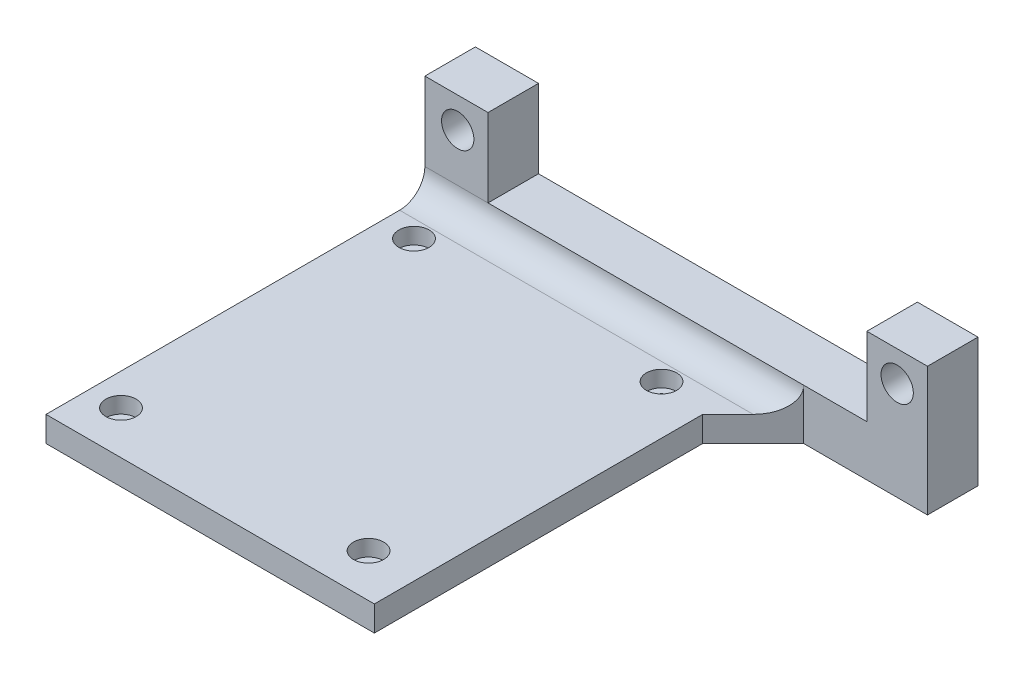
ISO-10303-21;
HEADER;
FILE_DESCRIPTION(('STEP AP214'),'2;1');
FILE_NAME('part.step','',(''),(''),'','','');
FILE_SCHEMA(('AUTOMOTIVE_DESIGN { 1 0 10303 214 1 1 1 1 }'));
ENDSEC;
DATA;
#1=APPLICATION_CONTEXT('core data for automotive mechanical design processes');
#2=APPLICATION_PROTOCOL_DEFINITION('international standard','automotive_design',2000,#1);
#3=PRODUCT_CONTEXT('',#1,'mechanical');
#4=PRODUCT('Part','Part','',(#3));
#5=PRODUCT_RELATED_PRODUCT_CATEGORY('part','',(#4));
#6=PRODUCT_DEFINITION_FORMATION('','',#4);
#7=PRODUCT_DEFINITION_CONTEXT('part definition',#1,'design');
#8=PRODUCT_DEFINITION('design','',#6,#7);
#9=PRODUCT_DEFINITION_SHAPE('','',#8);
#10=(LENGTH_UNIT() NAMED_UNIT(*) SI_UNIT(.MILLI.,.METRE.));
#11=(NAMED_UNIT(*) PLANE_ANGLE_UNIT() SI_UNIT($,.RADIAN.));
#12=(NAMED_UNIT(*) SI_UNIT($,.STERADIAN.) SOLID_ANGLE_UNIT());
#13=UNCERTAINTY_MEASURE_WITH_UNIT(LENGTH_MEASURE(1.E-05),#10,'distance_accuracy_value','');
#14=(GEOMETRIC_REPRESENTATION_CONTEXT(3) GLOBAL_UNCERTAINTY_ASSIGNED_CONTEXT((#13)) GLOBAL_UNIT_ASSIGNED_CONTEXT((#10,
#11,#12)) REPRESENTATION_CONTEXT('',''));
#15=CARTESIAN_POINT('',(0.,0.,0.));
#16=DIRECTION('',(0.,0.,1.));
#17=DIRECTION('',(1.,0.,0.));
#18=AXIS2_PLACEMENT_3D('',#15,#16,#17);
#19=CARTESIAN_POINT('',(0.,0.,10.));
#20=DIRECTION('',(0.,0.,-1.));
#21=DIRECTION('',(-1.,0.,0.));
#22=AXIS2_PLACEMENT_3D('',#19,#20,#21);
#23=PLANE('',#22);
#24=CARTESIAN_POINT('',(6.50000000000026,6.49999999999967,10.));
#25=DIRECTION('',(0.,0.,1.));
#26=DIRECTION('',(1.,0.,0.));
#27=AXIS2_PLACEMENT_3D('',#24,#25,#26);
#28=CIRCLE('',#27,3.2);
#29=CARTESIAN_POINT('',(9.70000000000026,6.49999999999967,10.));
#30=VERTEX_POINT('',#29);
#31=EDGE_CURVE('E204',#30,#30,#28,.T.);
#32=ORIENTED_EDGE('',*,*,#31,.F.);
#33=EDGE_LOOP('',(#32));
#34=FACE_BOUND('',#33,.T.);
#35=DIRECTION('',(0.,-1.,0.));
#36=VECTOR('',#35,1.);
#37=CARTESIAN_POINT('',(0.,12.4999999999997,10.));
#38=LINE('',#37,#36);
#39=CARTESIAN_POINT('',(0.,12.4999999999997,10.));
#40=VERTEX_POINT('',#39);
#41=CARTESIAN_POINT('',(0.,-3.00000000000001,10.));
#42=VERTEX_POINT('',#41);
#43=EDGE_CURVE('E240',#40,#42,#38,.T.);
#44=ORIENTED_EDGE('',*,*,#43,.T.);
#45=DIRECTION('',(-1.,0.,0.));
#46=VECTOR('',#45,1.);
#47=CARTESIAN_POINT('',(65.,-3.00000000000001,10.));
#48=LINE('',#47,#46);
#49=CARTESIAN_POINT('',(12.5,-3.00000000000001,10.));
#50=VERTEX_POINT('',#49);
#51=EDGE_CURVE('E314',#42,#50,#48,.F.);
#52=ORIENTED_EDGE('',*,*,#51,.T.);
#53=DIRECTION('',(0.,1.,0.));
#54=VECTOR('',#53,1.);
#55=CARTESIAN_POINT('',(12.5,12.4999999999997,10.));
#56=LINE('',#55,#54);
#57=CARTESIAN_POINT('',(12.5,12.4999999999997,10.));
#58=VERTEX_POINT('',#57);
#59=EDGE_CURVE('E234',#50,#58,#56,.T.);
#60=ORIENTED_EDGE('',*,*,#59,.T.);
#61=DIRECTION('',(-1.,0.,0.));
#62=VECTOR('',#61,1.);
#63=CARTESIAN_POINT('',(12.5,12.4999999999997,10.));
#64=LINE('',#63,#62);
#65=EDGE_CURVE('E237',#58,#40,#64,.T.);
#66=ORIENTED_EDGE('',*,*,#65,.T.);
#67=EDGE_LOOP('',(#44,#52,#60,#66));
#68=FACE_BOUND('',#67,.T.);
#69=ADVANCED_FACE('F53',(#34,#68),#23,.F.);
#70=CARTESIAN_POINT('',(93.5,6.49999999999999,10.));
#71=DIRECTION('',(0.,0.,1.));
#72=DIRECTION('',(1.,0.,0.));
#73=AXIS2_PLACEMENT_3D('',#70,#71,#72);
#74=CIRCLE('',#73,3.2);
#75=CARTESIAN_POINT('',(96.7,6.49999999999999,10.));
#76=VERTEX_POINT('',#75);
#77=EDGE_CURVE('E212',#76,#76,#74,.T.);
#78=ORIENTED_EDGE('',*,*,#77,.F.);
#79=EDGE_LOOP('',(#78));
#80=FACE_BOUND('',#79,.T.);
#81=DIRECTION('',(-1.,0.,0.));
#82=VECTOR('',#81,1.);
#83=CARTESIAN_POINT('',(87.5,-3.,10.));
#84=LINE('',#83,#82);
#85=CARTESIAN_POINT('',(87.5,-3.,10.));
#86=VERTEX_POINT('',#85);
#87=CARTESIAN_POINT('',(75.,-3.,10.));
#88=VERTEX_POINT('',#87);
#89=EDGE_CURVE('E231',#86,#88,#84,.T.);
#90=ORIENTED_EDGE('',*,*,#89,.T.);
#91=DIRECTION('',(0.,-1.,0.));
#92=VECTOR('',#91,1.);
#93=CARTESIAN_POINT('',(75.,-13.,10.));
#94=LINE('',#93,#92);
#95=CARTESIAN_POINT('',(75.,-13.,10.));
#96=VERTEX_POINT('',#95);
#97=EDGE_CURVE('E324',#88,#96,#94,.T.);
#98=ORIENTED_EDGE('',*,*,#97,.T.);
#99=DIRECTION('',(1.,0.,0.));
#100=VECTOR('',#99,1.);
#101=CARTESIAN_POINT('',(99.5,-13.,10.));
#102=LINE('',#101,#100);
#103=CARTESIAN_POINT('',(99.5,-13.,10.));
#104=VERTEX_POINT('',#103);
#105=EDGE_CURVE('E244',#96,#104,#102,.T.);
#106=ORIENTED_EDGE('',*,*,#105,.T.);
#107=DIRECTION('',(0.,1.,0.));
#108=VECTOR('',#107,1.);
#109=CARTESIAN_POINT('',(99.5,12.4999999999997,10.));
#110=LINE('',#109,#108);
#111=CARTESIAN_POINT('',(99.5,12.4999999999997,10.));
#112=VERTEX_POINT('',#111);
#113=EDGE_CURVE('E220',#104,#112,#110,.T.);
#114=ORIENTED_EDGE('',*,*,#113,.T.);
#115=DIRECTION('',(-1.,0.,0.));
#116=VECTOR('',#115,1.);
#117=CARTESIAN_POINT('',(99.5,12.4999999999997,10.));
#118=LINE('',#117,#116);
#119=CARTESIAN_POINT('',(87.5,12.4999999999997,10.));
#120=VERTEX_POINT('',#119);
#121=EDGE_CURVE('E224',#112,#120,#118,.T.);
#122=ORIENTED_EDGE('',*,*,#121,.T.);
#123=DIRECTION('',(0.,-1.,0.));
#124=VECTOR('',#123,1.);
#125=CARTESIAN_POINT('',(87.5,12.4999999999997,10.));
#126=LINE('',#125,#124);
#127=EDGE_CURVE('E228',#120,#86,#126,.T.);
#128=ORIENTED_EDGE('',*,*,#127,.T.);
#129=EDGE_LOOP('',(#90,#98,#106,#114,#122,#128));
#130=FACE_BOUND('',#129,.T.);
#131=ADVANCED_FACE('F380',(#80,#130),#23,.F.);
#132=CARTESIAN_POINT('',(0.,0.,0.));
#133=DIRECTION('',(0.,0.,-1.));
#134=DIRECTION('',(-1.,0.,0.));
#135=AXIS2_PLACEMENT_3D('',#132,#133,#134);
#136=PLANE('',#135);
#137=CARTESIAN_POINT('',(93.5,6.49999999999999,0.));
#138=DIRECTION('',(0.,0.,1.));
#139=DIRECTION('',(1.,0.,0.));
#140=AXIS2_PLACEMENT_3D('',#137,#138,#139);
#141=CIRCLE('',#140,3.2);
#142=CARTESIAN_POINT('',(96.7,6.49999999999999,0.));
#143=VERTEX_POINT('',#142);
#144=EDGE_CURVE('E208',#143,#143,#141,.T.);
#145=ORIENTED_EDGE('',*,*,#144,.T.);
#146=EDGE_LOOP('',(#145));
#147=FACE_BOUND('',#146,.T.);
#148=DIRECTION('',(0.,1.,0.));
#149=VECTOR('',#148,1.);
#150=CARTESIAN_POINT('',(99.5,12.4999999999997,0.));
#151=LINE('',#150,#149);
#152=CARTESIAN_POINT('',(99.5,-13.,0.));
#153=VERTEX_POINT('',#152);
#154=CARTESIAN_POINT('',(99.5,12.4999999999997,0.));
#155=VERTEX_POINT('',#154);
#156=EDGE_CURVE('E216',#153,#155,#151,.T.);
#157=ORIENTED_EDGE('',*,*,#156,.F.);
#158=DIRECTION('',(1.,0.,0.));
#159=VECTOR('',#158,1.);
#160=CARTESIAN_POINT('',(99.5,-13.,0.));
#161=LINE('',#160,#159);
#162=CARTESIAN_POINT('',(0.,-13.,0.));
#163=VERTEX_POINT('',#162);
#164=EDGE_CURVE('E225',#163,#153,#161,.T.);
#165=ORIENTED_EDGE('',*,*,#164,.F.);
#166=DIRECTION('',(0.,-1.,0.));
#167=VECTOR('',#166,1.);
#168=CARTESIAN_POINT('',(0.,12.4999999999997,0.));
#169=LINE('',#168,#167);
#170=CARTESIAN_POINT('',(0.,12.4999999999997,0.));
#171=VERTEX_POINT('',#170);
#172=EDGE_CURVE('E160',#171,#163,#169,.T.);
#173=ORIENTED_EDGE('',*,*,#172,.F.);
#174=DIRECTION('',(-1.,0.,0.));
#175=VECTOR('',#174,1.);
#176=CARTESIAN_POINT('',(12.5,12.4999999999997,0.));
#177=LINE('',#176,#175);
#178=CARTESIAN_POINT('',(12.5,12.4999999999997,0.));
#179=VERTEX_POINT('',#178);
#180=EDGE_CURVE('E262',#179,#171,#177,.T.);
#181=ORIENTED_EDGE('',*,*,#180,.F.);
#182=DIRECTION('',(0.,1.,0.));
#183=VECTOR('',#182,1.);
#184=CARTESIAN_POINT('',(12.5,12.4999999999997,0.));
#185=LINE('',#184,#183);
#186=CARTESIAN_POINT('',(12.5,-3.00000000000001,0.));
#187=VERTEX_POINT('',#186);
#188=EDGE_CURVE('E259',#187,#179,#185,.T.);
#189=ORIENTED_EDGE('',*,*,#188,.F.);
#190=DIRECTION('',(-1.,0.,0.));
#191=VECTOR('',#190,1.);
#192=CARTESIAN_POINT('',(87.5,-3.,0.));
#193=LINE('',#192,#191);
#194=CARTESIAN_POINT('',(87.5,-3.,0.));
#195=VERTEX_POINT('',#194);
#196=EDGE_CURVE('E256',#195,#187,#193,.T.);
#197=ORIENTED_EDGE('',*,*,#196,.F.);
#198=DIRECTION('',(0.,-1.,0.));
#199=VECTOR('',#198,1.);
#200=CARTESIAN_POINT('',(87.5,12.4999999999997,0.));
#201=LINE('',#200,#199);
#202=CARTESIAN_POINT('',(87.5,12.4999999999997,0.));
#203=VERTEX_POINT('',#202);
#204=EDGE_CURVE('E253',#203,#195,#201,.T.);
#205=ORIENTED_EDGE('',*,*,#204,.F.);
#206=DIRECTION('',(-1.,0.,0.));
#207=VECTOR('',#206,1.);
#208=CARTESIAN_POINT('',(99.5,12.4999999999997,0.));
#209=LINE('',#208,#207);
#210=EDGE_CURVE('E250',#155,#203,#209,.T.);
#211=ORIENTED_EDGE('',*,*,#210,.F.);
#212=EDGE_LOOP('',(#157,#165,#173,#181,#189,#197,#205,#211));
#213=FACE_BOUND('',#212,.T.);
#214=CARTESIAN_POINT('',(6.50000000000026,6.49999999999967,0.));
#215=DIRECTION('',(0.,0.,1.));
#216=DIRECTION('',(1.,0.,0.));
#217=AXIS2_PLACEMENT_3D('',#214,#215,#216);
#218=CIRCLE('',#217,3.2);
#219=CARTESIAN_POINT('',(9.70000000000026,6.49999999999967,0.));
#220=VERTEX_POINT('',#219);
#221=EDGE_CURVE('E203',#220,#220,#218,.T.);
#222=ORIENTED_EDGE('',*,*,#221,.T.);
#223=EDGE_LOOP('',(#222));
#224=FACE_BOUND('',#223,.T.);
#225=ADVANCED_FACE('F386',(#147,#213,#224),#136,.T.);
#226=CARTESIAN_POINT('',(99.5,12.4999999999997,10.));
#227=DIRECTION('',(-1.,0.,0.));
#228=DIRECTION('',(0.,0.,1.));
#229=AXIS2_PLACEMENT_3D('',#226,#227,#228);
#230=PLANE('',#229);
#231=ORIENTED_EDGE('',*,*,#156,.T.);
#232=DIRECTION('',(0.,0.,-1.));
#233=VECTOR('',#232,1.);
#234=CARTESIAN_POINT('',(99.5,12.4999999999997,10.));
#235=LINE('',#234,#233);
#236=EDGE_CURVE('E290',#112,#155,#235,.T.);
#237=ORIENTED_EDGE('',*,*,#236,.F.);
#238=ORIENTED_EDGE('',*,*,#113,.F.);
#239=DIRECTION('',(0.,0.,-1.));
#240=VECTOR('',#239,1.);
#241=CARTESIAN_POINT('',(99.5,-13.,10.));
#242=LINE('',#241,#240);
#243=EDGE_CURVE('E165',#104,#153,#242,.T.);
#244=ORIENTED_EDGE('',*,*,#243,.T.);
#245=EDGE_LOOP('',(#231,#237,#238,#244));
#246=FACE_BOUND('',#245,.T.);
#247=ADVANCED_FACE('F396',(#246),#230,.F.);
#248=CARTESIAN_POINT('',(99.5,12.4999999999997,10.));
#249=DIRECTION('',(0.,-1.,0.));
#250=DIRECTION('',(1.,0.,0.));
#251=AXIS2_PLACEMENT_3D('',#248,#249,#250);
#252=PLANE('',#251);
#253=ORIENTED_EDGE('',*,*,#210,.T.);
#254=DIRECTION('',(0.,0.,-1.));
#255=VECTOR('',#254,1.);
#256=CARTESIAN_POINT('',(87.5,12.4999999999997,10.));
#257=LINE('',#256,#255);
#258=EDGE_CURVE('E286',#120,#203,#257,.T.);
#259=ORIENTED_EDGE('',*,*,#258,.F.);
#260=ORIENTED_EDGE('',*,*,#121,.F.);
#261=ORIENTED_EDGE('',*,*,#236,.T.);
#262=EDGE_LOOP('',(#253,#259,#260,#261));
#263=FACE_BOUND('',#262,.T.);
#264=ADVANCED_FACE('F417',(#263),#252,.F.);
#265=CARTESIAN_POINT('',(87.5,12.4999999999997,10.));
#266=DIRECTION('',(1.,0.,0.));
#267=DIRECTION('',(0.,0.,-1.));
#268=AXIS2_PLACEMENT_3D('',#265,#266,#267);
#269=PLANE('',#268);
#270=ORIENTED_EDGE('',*,*,#204,.T.);
#271=DIRECTION('',(0.,0.,-1.));
#272=VECTOR('',#271,1.);
#273=CARTESIAN_POINT('',(87.5,-3.,10.));
#274=LINE('',#273,#272);
#275=EDGE_CURVE('E282',#86,#195,#274,.T.);
#276=ORIENTED_EDGE('',*,*,#275,.F.);
#277=ORIENTED_EDGE('',*,*,#127,.F.);
#278=ORIENTED_EDGE('',*,*,#258,.T.);
#279=EDGE_LOOP('',(#270,#276,#277,#278));
#280=FACE_BOUND('',#279,.T.);
#281=ADVANCED_FACE('F414',(#280),#269,.F.);
#282=CARTESIAN_POINT('',(87.5,-3.,10.));
#283=DIRECTION('',(0.,-1.,0.));
#284=DIRECTION('',(1.,0.,0.));
#285=AXIS2_PLACEMENT_3D('',#282,#283,#284);
#286=PLANE('',#285);
#287=ORIENTED_EDGE('',*,*,#196,.T.);
#288=DIRECTION('',(0.,0.,-1.));
#289=VECTOR('',#288,1.);
#290=CARTESIAN_POINT('',(12.5,-3.00000000000001,10.));
#291=LINE('',#290,#289);
#292=EDGE_CURVE('E278',#50,#187,#291,.T.);
#293=ORIENTED_EDGE('',*,*,#292,.F.);
#294=EDGE_CURVE('E69',#88,#50,#84,.T.);
#295=ORIENTED_EDGE('',*,*,#294,.F.);
#296=ORIENTED_EDGE('',*,*,#89,.F.);
#297=ORIENTED_EDGE('',*,*,#275,.T.);
#298=EDGE_LOOP('',(#287,#293,#295,#296,#297));
#299=FACE_BOUND('',#298,.T.);
#300=ADVANCED_FACE('F410',(#299),#286,.F.);
#301=CARTESIAN_POINT('',(12.5,12.4999999999997,10.));
#302=DIRECTION('',(-1.,0.,0.));
#303=DIRECTION('',(0.,-1.,0.));
#304=AXIS2_PLACEMENT_3D('',#301,#302,#303);
#305=PLANE('',#304);
#306=ORIENTED_EDGE('',*,*,#188,.T.);
#307=DIRECTION('',(0.,0.,-1.));
#308=VECTOR('',#307,1.);
#309=CARTESIAN_POINT('',(12.5,12.4999999999997,10.));
#310=LINE('',#309,#308);
#311=EDGE_CURVE('E274',#58,#179,#310,.T.);
#312=ORIENTED_EDGE('',*,*,#311,.F.);
#313=ORIENTED_EDGE('',*,*,#59,.F.);
#314=ORIENTED_EDGE('',*,*,#292,.T.);
#315=EDGE_LOOP('',(#306,#312,#313,#314));
#316=FACE_BOUND('',#315,.T.);
#317=ADVANCED_FACE('F406',(#316),#305,.F.);
#318=CARTESIAN_POINT('',(12.5,12.4999999999997,10.));
#319=DIRECTION('',(0.,-1.,0.));
#320=DIRECTION('',(1.,0.,0.));
#321=AXIS2_PLACEMENT_3D('',#318,#319,#320);
#322=PLANE('',#321);
#323=ORIENTED_EDGE('',*,*,#180,.T.);
#324=DIRECTION('',(0.,0.,-1.));
#325=VECTOR('',#324,1.);
#326=CARTESIAN_POINT('',(0.,12.4999999999997,10.));
#327=LINE('',#326,#325);
#328=EDGE_CURVE('E164',#40,#171,#327,.T.);
#329=ORIENTED_EDGE('',*,*,#328,.F.);
#330=ORIENTED_EDGE('',*,*,#65,.F.);
#331=ORIENTED_EDGE('',*,*,#311,.T.);
#332=EDGE_LOOP('',(#323,#329,#330,#331));
#333=FACE_BOUND('',#332,.T.);
#334=ADVANCED_FACE('F403',(#333),#322,.F.);
#335=CARTESIAN_POINT('',(0.,12.4999999999997,10.));
#336=DIRECTION('',(1.,0.,0.));
#337=DIRECTION('',(0.,1.,0.));
#338=AXIS2_PLACEMENT_3D('',#335,#336,#337);
#339=PLANE('',#338);
#340=ORIENTED_EDGE('',*,*,#172,.T.);
#341=DIRECTION('',(0.,0.,-1.));
#342=VECTOR('',#341,1.);
#343=CARTESIAN_POINT('',(0.,-13.,10.));
#344=LINE('',#343,#342);
#345=CARTESIAN_POINT('',(0.,-13.,85.));
#346=VERTEX_POINT('',#345);
#347=EDGE_CURVE('E152',#346,#163,#344,.T.);
#348=ORIENTED_EDGE('',*,*,#347,.F.);
#349=DIRECTION('',(0.,-1.,0.));
#350=VECTOR('',#349,1.);
#351=CARTESIAN_POINT('',(0.,-13.,85.));
#352=LINE('',#351,#350);
#353=CARTESIAN_POINT('',(0.,-8.00000000000001,85.));
#354=VERTEX_POINT('',#353);
#355=EDGE_CURVE('E157',#354,#346,#352,.T.);
#356=ORIENTED_EDGE('',*,*,#355,.F.);
#357=DIRECTION('',(0.,0.,-1.));
#358=VECTOR('',#357,1.);
#359=CARTESIAN_POINT('',(0.,-8.00000000000001,85.));
#360=LINE('',#359,#358);
#361=CARTESIAN_POINT('',(0.,-8.00000000000001,15.));
#362=VERTEX_POINT('',#361);
#363=EDGE_CURVE('E194',#354,#362,#360,.T.);
#364=ORIENTED_EDGE('',*,*,#363,.T.);
#365=CARTESIAN_POINT('',(0.,-3.00000000000001,15.));
#366=DIRECTION('',(1.,0.,0.));
#367=DIRECTION('',(0.,1.,0.));
#368=AXIS2_PLACEMENT_3D('',#365,#366,#367);
#369=CIRCLE('',#368,5.);
#370=EDGE_CURVE('E317',#362,#42,#369,.T.);
#371=ORIENTED_EDGE('',*,*,#370,.T.);
#372=ORIENTED_EDGE('',*,*,#43,.F.);
#373=ORIENTED_EDGE('',*,*,#328,.T.);
#374=EDGE_LOOP('',(#340,#348,#356,#364,#371,#372,#373));
#375=FACE_BOUND('',#374,.T.);
#376=ADVANCED_FACE('F154',(#375),#339,.F.);
#377=CARTESIAN_POINT('',(99.5,-13.,10.));
#378=DIRECTION('',(0.,1.,0.));
#379=DIRECTION('',(-1.,0.,0.));
#380=AXIS2_PLACEMENT_3D('',#377,#378,#379);
#381=PLANE('',#380);
#382=CARTESIAN_POINT('',(55.310001239777,-13.,18.4577046189221));
#383=DIRECTION('',(0.,1.,0.));
#384=DIRECTION('',(-1.,0.,0.));
#385=AXIS2_PLACEMENT_3D('',#382,#383,#384);
#386=CIRCLE('',#385,4.5);
#387=CARTESIAN_POINT('',(50.810001239777,-13.,18.4577046189221));
#388=VERTEX_POINT('',#387);
#389=EDGE_CURVE('E352',#388,#388,#386,.T.);
#390=ORIENTED_EDGE('',*,*,#389,.T.);
#391=EDGE_LOOP('',(#390));
#392=FACE_BOUND('',#391,.T.);
#393=CARTESIAN_POINT('',(6.31000123977702,-13.,18.4577046189221));
#394=DIRECTION('',(0.,1.,0.));
#395=DIRECTION('',(-1.,0.,0.));
#396=AXIS2_PLACEMENT_3D('',#393,#394,#395);
#397=CIRCLE('',#396,4.5);
#398=CARTESIAN_POINT('',(1.81000123977702,-13.,18.4577046189221));
#399=VERTEX_POINT('',#398);
#400=EDGE_CURVE('E348',#399,#399,#397,.T.);
#401=ORIENTED_EDGE('',*,*,#400,.T.);
#402=EDGE_LOOP('',(#401));
#403=FACE_BOUND('',#402,.T.);
#404=CARTESIAN_POINT('',(6.31000123977702,-13.,76.4577046189221));
#405=DIRECTION('',(0.,1.,0.));
#406=DIRECTION('',(-1.,0.,0.));
#407=AXIS2_PLACEMENT_3D('',#404,#405,#406);
#408=CIRCLE('',#407,4.5);
#409=CARTESIAN_POINT('',(1.81000123977702,-13.,76.4577046189221));
#410=VERTEX_POINT('',#409);
#411=EDGE_CURVE('E344',#410,#410,#408,.T.);
#412=ORIENTED_EDGE('',*,*,#411,.T.);
#413=EDGE_LOOP('',(#412));
#414=FACE_BOUND('',#413,.T.);
#415=CARTESIAN_POINT('',(55.310001239777,-13.,76.4577046189221));
#416=DIRECTION('',(0.,1.,0.));
#417=DIRECTION('',(-1.,0.,0.));
#418=AXIS2_PLACEMENT_3D('',#415,#416,#417);
#419=CIRCLE('',#418,4.5);
#420=CARTESIAN_POINT('',(50.810001239777,-13.,76.4577046189221));
#421=VERTEX_POINT('',#420);
#422=EDGE_CURVE('E340',#421,#421,#419,.T.);
#423=ORIENTED_EDGE('',*,*,#422,.T.);
#424=EDGE_LOOP('',(#423));
#425=FACE_BOUND('',#424,.T.);
#426=ORIENTED_EDGE('',*,*,#164,.T.);
#427=ORIENTED_EDGE('',*,*,#243,.F.);
#428=ORIENTED_EDGE('',*,*,#105,.F.);
#429=DIRECTION('',(0.707106781186543,0.,-0.707106781186552));
#430=VECTOR('',#429,1.);
#431=CARTESIAN_POINT('',(87.2499999999998,-13.,-2.25000000000003));
#432=LINE('',#431,#430);
#433=CARTESIAN_POINT('',(65.,-13.,20.0000000000001));
#434=VERTEX_POINT('',#433);
#435=EDGE_CURVE('E333',#96,#434,#432,.F.);
#436=ORIENTED_EDGE('',*,*,#435,.T.);
#437=DIRECTION('',(0.,0.,-1.));
#438=VECTOR('',#437,1.);
#439=CARTESIAN_POINT('',(65.,-13.,85.));
#440=LINE('',#439,#438);
#441=CARTESIAN_POINT('',(65.,-13.,85.));
#442=VERTEX_POINT('',#441);
#443=EDGE_CURVE('E171',#442,#434,#440,.T.);
#444=ORIENTED_EDGE('',*,*,#443,.F.);
#445=DIRECTION('',(1.,0.,0.));
#446=VECTOR('',#445,1.);
#447=CARTESIAN_POINT('',(0.,-13.,85.));
#448=LINE('',#447,#446);
#449=EDGE_CURVE('E168',#346,#442,#448,.T.);
#450=ORIENTED_EDGE('',*,*,#449,.F.);
#451=ORIENTED_EDGE('',*,*,#347,.T.);
#452=EDGE_LOOP('',(#426,#427,#428,#436,#444,#450,#451));
#453=FACE_BOUND('',#452,.T.);
#454=ADVANCED_FACE('F169',(#392,#403,#414,#425,#453),#381,.F.);
#455=CARTESIAN_POINT('',(93.5,6.49999999999999,10.));
#456=DIRECTION('',(0.,0.,-1.));
#457=DIRECTION('',(-1.,0.,0.));
#458=AXIS2_PLACEMENT_3D('',#455,#456,#457);
#459=CYLINDRICAL_SURFACE('',#458,3.2);
#460=ORIENTED_EDGE('',*,*,#77,.T.);
#461=EDGE_LOOP('',(#460));
#462=FACE_BOUND('',#461,.T.);
#463=ORIENTED_EDGE('',*,*,#144,.F.);
#464=EDGE_LOOP('',(#463));
#465=FACE_BOUND('',#464,.T.);
#466=ADVANCED_FACE('F392',(#462,#465),#459,.F.);
#467=CARTESIAN_POINT('',(6.50000000000026,6.49999999999967,10.));
#468=DIRECTION('',(0.,0.,-1.));
#469=DIRECTION('',(-1.,0.,0.));
#470=AXIS2_PLACEMENT_3D('',#467,#468,#469);
#471=CYLINDRICAL_SURFACE('',#470,3.2);
#472=ORIENTED_EDGE('',*,*,#31,.T.);
#473=EDGE_LOOP('',(#472));
#474=FACE_BOUND('',#473,.T.);
#475=ORIENTED_EDGE('',*,*,#221,.F.);
#476=EDGE_LOOP('',(#475));
#477=FACE_BOUND('',#476,.T.);
#478=ADVANCED_FACE('F545',(#474,#477),#471,.F.);
#479=CARTESIAN_POINT('',(65.,-13.,85.));
#480=DIRECTION('',(-1.,0.,0.));
#481=DIRECTION('',(0.,0.,1.));
#482=AXIS2_PLACEMENT_3D('',#479,#480,#481);
#483=PLANE('',#482);
#484=ORIENTED_EDGE('',*,*,#443,.T.);
#485=DIRECTION('',(0.,1.,0.));
#486=VECTOR('',#485,1.);
#487=CARTESIAN_POINT('',(65.,-3.,20.0000000000001));
#488=LINE('',#487,#486);
#489=CARTESIAN_POINT('',(65.,-8.00000000000001,20.0000000000001));
#490=VERTEX_POINT('',#489);
#491=EDGE_CURVE('E320',#434,#490,#488,.T.);
#492=ORIENTED_EDGE('',*,*,#491,.T.);
#493=DIRECTION('',(0.,0.,-1.));
#494=VECTOR('',#493,1.);
#495=CARTESIAN_POINT('',(65.,-8.00000000000001,85.));
#496=LINE('',#495,#494);
#497=CARTESIAN_POINT('',(65.,-8.00000000000001,85.));
#498=VERTEX_POINT('',#497);
#499=EDGE_CURVE('E197',#498,#490,#496,.T.);
#500=ORIENTED_EDGE('',*,*,#499,.F.);
#501=DIRECTION('',(0.,1.,0.));
#502=VECTOR('',#501,1.);
#503=CARTESIAN_POINT('',(65.,-13.,85.));
#504=LINE('',#503,#502);
#505=EDGE_CURVE('E175',#442,#498,#504,.T.);
#506=ORIENTED_EDGE('',*,*,#505,.F.);
#507=EDGE_LOOP('',(#484,#492,#500,#506));
#508=FACE_BOUND('',#507,.T.);
#509=ADVANCED_FACE('F542',(#508),#483,.F.);
#510=CARTESIAN_POINT('',(0.,-8.00000000000001,85.));
#511=DIRECTION('',(0.,-1.,0.));
#512=DIRECTION('',(0.,0.,-1.));
#513=AXIS2_PLACEMENT_3D('',#510,#511,#512);
#514=PLANE('',#513);
#515=CARTESIAN_POINT('',(6.31000123977701,-8.00000000000001,18.4577046189221));
#516=DIRECTION('',(0.,-1.,0.));
#517=DIRECTION('',(0.,0.,-1.));
#518=AXIS2_PLACEMENT_3D('',#515,#516,#517);
#519=CIRCLE('',#518,3.);
#520=CARTESIAN_POINT('',(6.31000123977701,-8.00000000000001,15.4577046189221));
#521=VERTEX_POINT('',#520);
#522=EDGE_CURVE('E472',#521,#521,#519,.F.);
#523=ORIENTED_EDGE('',*,*,#522,.F.);
#524=EDGE_LOOP('',(#523));
#525=FACE_BOUND('',#524,.T.);
#526=CARTESIAN_POINT('',(55.310001239777,-8.00000000000001,18.4577046189221));
#527=DIRECTION('',(0.,-1.,0.));
#528=DIRECTION('',(0.,0.,-1.));
#529=AXIS2_PLACEMENT_3D('',#526,#527,#528);
#530=CIRCLE('',#529,3.);
#531=CARTESIAN_POINT('',(55.310001239777,-8.00000000000001,15.4577046189221));
#532=VERTEX_POINT('',#531);
#533=EDGE_CURVE('E480',#532,#532,#530,.F.);
#534=ORIENTED_EDGE('',*,*,#533,.F.);
#535=EDGE_LOOP('',(#534));
#536=FACE_BOUND('',#535,.T.);
#537=CARTESIAN_POINT('',(55.310001239777,-8.00000000000001,76.4577046189221));
#538=DIRECTION('',(0.,-1.,0.));
#539=DIRECTION('',(0.,0.,-1.));
#540=AXIS2_PLACEMENT_3D('',#537,#538,#539);
#541=CIRCLE('',#540,3.);
#542=CARTESIAN_POINT('',(55.310001239777,-8.00000000000001,73.4577046189221));
#543=VERTEX_POINT('',#542);
#544=EDGE_CURVE('E471',#543,#543,#541,.F.);
#545=ORIENTED_EDGE('',*,*,#544,.F.);
#546=EDGE_LOOP('',(#545));
#547=FACE_BOUND('',#546,.T.);
#548=CARTESIAN_POINT('',(6.31000123977701,-8.00000000000001,76.4577046189221));
#549=DIRECTION('',(0.,-1.,0.));
#550=DIRECTION('',(0.,0.,-1.));
#551=AXIS2_PLACEMENT_3D('',#548,#549,#550);
#552=CIRCLE('',#551,3.);
#553=CARTESIAN_POINT('',(6.31000123977701,-8.00000000000001,73.4577046189221));
#554=VERTEX_POINT('',#553);
#555=EDGE_CURVE('E461',#554,#554,#552,.F.);
#556=ORIENTED_EDGE('',*,*,#555,.F.);
#557=EDGE_LOOP('',(#556));
#558=FACE_BOUND('',#557,.T.);
#559=ORIENTED_EDGE('',*,*,#499,.T.);
#560=DIRECTION('',(-0.707106781186543,0.,0.707106781186552));
#561=VECTOR('',#560,1.);
#562=CARTESIAN_POINT('',(0.,-8.00000000000001,85.));
#563=LINE('',#562,#561);
#564=CARTESIAN_POINT('',(70.,-8.00000000000001,15.));
#565=VERTEX_POINT('',#564);
#566=EDGE_CURVE('E327',#490,#565,#563,.F.);
#567=ORIENTED_EDGE('',*,*,#566,.T.);
#568=DIRECTION('',(-1.,0.,0.));
#569=VECTOR('',#568,1.);
#570=CARTESIAN_POINT('',(0.,-8.00000000000001,15.));
#571=LINE('',#570,#569);
#572=EDGE_CURVE('E77',#565,#362,#571,.T.);
#573=ORIENTED_EDGE('',*,*,#572,.T.);
#574=ORIENTED_EDGE('',*,*,#363,.F.);
#575=DIRECTION('',(-1.,0.,0.));
#576=VECTOR('',#575,1.);
#577=CARTESIAN_POINT('',(0.,-8.00000000000001,85.));
#578=LINE('',#577,#576);
#579=EDGE_CURVE('E179',#498,#354,#578,.T.);
#580=ORIENTED_EDGE('',*,*,#579,.F.);
#581=EDGE_LOOP('',(#559,#567,#573,#574,#580));
#582=FACE_BOUND('',#581,.T.);
#583=ADVANCED_FACE('F539',(#525,#536,#547,#558,#582),#514,.F.);
#584=CARTESIAN_POINT('',(0.,0.,85.));
#585=DIRECTION('',(0.,0.,-1.));
#586=DIRECTION('',(-1.,0.,0.));
#587=AXIS2_PLACEMENT_3D('',#584,#585,#586);
#588=PLANE('',#587);
#589=ORIENTED_EDGE('',*,*,#355,.T.);
#590=ORIENTED_EDGE('',*,*,#449,.T.);
#591=ORIENTED_EDGE('',*,*,#505,.T.);
#592=ORIENTED_EDGE('',*,*,#579,.T.);
#593=EDGE_LOOP('',(#589,#590,#591,#592));
#594=FACE_BOUND('',#593,.T.);
#595=ADVANCED_FACE('F177',(#594),#588,.F.);
#596=CARTESIAN_POINT('',(6.31000123977702,-16.,76.4577046189221));
#597=DIRECTION('',(0.,1.,0.));
#598=DIRECTION('',(-1.,0.,0.));
#599=AXIS2_PLACEMENT_3D('',#596,#597,#598);
#600=CYLINDRICAL_SURFACE('',#599,3.);
#601=CARTESIAN_POINT('',(6.31000123977702,-14.5,76.4577046189221));
#602=DIRECTION('',(0.,1.,0.));
#603=DIRECTION('',(-1.,0.,0.));
#604=AXIS2_PLACEMENT_3D('',#601,#602,#603);
#605=CIRCLE('',#604,3.);
#606=CARTESIAN_POINT('',(3.31000123977702,-14.5,76.4577046189221));
#607=VERTEX_POINT('',#606);
#608=EDGE_CURVE('E62',#607,#607,#605,.F.);
#609=ORIENTED_EDGE('',*,*,#608,.T.);
#610=EDGE_LOOP('',(#609));
#611=FACE_BOUND('',#610,.T.);
#612=CARTESIAN_POINT('',(6.31000123977702,-16.,76.4577046189221));
#613=DIRECTION('',(0.,-1.,0.));
#614=DIRECTION('',(1.,0.,0.));
#615=AXIS2_PLACEMENT_3D('',#612,#613,#614);
#616=CIRCLE('',#615,3.);
#617=CARTESIAN_POINT('',(9.31000123977702,-16.,76.4577046189221));
#618=VERTEX_POINT('',#617);
#619=EDGE_CURVE('E182',#618,#618,#616,.T.);
#620=ORIENTED_EDGE('',*,*,#619,.F.);
#621=EDGE_LOOP('',(#620));
#622=FACE_BOUND('',#621,.T.);
#623=ADVANCED_FACE('F363',(#611,#622),#600,.T.);
#624=CARTESIAN_POINT('',(6.31000123977702,-16.,76.4577046189221));
#625=DIRECTION('',(0.,-1.,0.));
#626=DIRECTION('',(1.,0.,0.));
#627=AXIS2_PLACEMENT_3D('',#624,#625,#626);
#628=PLANE('',#627);
#629=CARTESIAN_POINT('',(6.31000123977702,-16.,76.4577046189221));
#630=DIRECTION('',(0.,-1.,0.));
#631=DIRECTION('',(1.,0.,0.));
#632=AXIS2_PLACEMENT_3D('',#629,#630,#631);
#633=CIRCLE('',#632,1.60000000000001);
#634=CARTESIAN_POINT('',(7.91000123977703,-16.,76.4577046189221));
#635=VERTEX_POINT('',#634);
#636=EDGE_CURVE('E299',#635,#635,#633,.T.);
#637=ORIENTED_EDGE('',*,*,#636,.F.);
#638=EDGE_LOOP('',(#637));
#639=FACE_BOUND('',#638,.T.);
#640=ORIENTED_EDGE('',*,*,#619,.T.);
#641=EDGE_LOOP('',(#640));
#642=FACE_BOUND('',#641,.T.);
#643=ADVANCED_FACE('F530',(#639,#642),#628,.T.);
#644=CARTESIAN_POINT('',(55.310001239777,-16.,76.4577046189221));
#645=DIRECTION('',(0.,1.,0.));
#646=DIRECTION('',(-1.,0.,0.));
#647=AXIS2_PLACEMENT_3D('',#644,#645,#646);
#648=CYLINDRICAL_SURFACE('',#647,3.);
#649=CARTESIAN_POINT('',(55.310001239777,-14.5,76.4577046189221));
#650=DIRECTION('',(0.,1.,0.));
#651=DIRECTION('',(-1.,0.,0.));
#652=AXIS2_PLACEMENT_3D('',#649,#650,#651);
#653=CIRCLE('',#652,3.);
#654=CARTESIAN_POINT('',(52.310001239777,-14.5,76.4577046189221));
#655=VERTEX_POINT('',#654);
#656=EDGE_CURVE('E13',#655,#655,#653,.F.);
#657=ORIENTED_EDGE('',*,*,#656,.T.);
#658=EDGE_LOOP('',(#657));
#659=FACE_BOUND('',#658,.T.);
#660=CARTESIAN_POINT('',(55.310001239777,-16.,76.4577046189221));
#661=DIRECTION('',(0.,-1.,0.));
#662=DIRECTION('',(1.,0.,0.));
#663=AXIS2_PLACEMENT_3D('',#660,#661,#662);
#664=CIRCLE('',#663,3.);
#665=CARTESIAN_POINT('',(58.310001239777,-16.,76.4577046189221));
#666=VERTEX_POINT('',#665);
#667=EDGE_CURVE('E186',#666,#666,#664,.T.);
#668=ORIENTED_EDGE('',*,*,#667,.F.);
#669=EDGE_LOOP('',(#668));
#670=FACE_BOUND('',#669,.T.);
#671=ADVANCED_FACE('F526',(#659,#670),#648,.T.);
#672=CARTESIAN_POINT('',(55.310001239777,-16.,76.4577046189221));
#673=DIRECTION('',(0.,-1.,0.));
#674=DIRECTION('',(1.,0.,0.));
#675=AXIS2_PLACEMENT_3D('',#672,#673,#674);
#676=PLANE('',#675);
#677=CARTESIAN_POINT('',(55.310001239777,-16.,76.4577046189221));
#678=DIRECTION('',(0.,-1.,0.));
#679=DIRECTION('',(1.,0.,0.));
#680=AXIS2_PLACEMENT_3D('',#677,#678,#679);
#681=CIRCLE('',#680,1.60000000000001);
#682=CARTESIAN_POINT('',(56.910001239777,-16.,76.4577046189221));
#683=VERTEX_POINT('',#682);
#684=EDGE_CURVE('E497',#683,#683,#681,.T.);
#685=ORIENTED_EDGE('',*,*,#684,.F.);
#686=EDGE_LOOP('',(#685));
#687=FACE_BOUND('',#686,.T.);
#688=ORIENTED_EDGE('',*,*,#667,.T.);
#689=EDGE_LOOP('',(#688));
#690=FACE_BOUND('',#689,.T.);
#691=ADVANCED_FACE('F448',(#687,#690),#676,.T.);
#692=CARTESIAN_POINT('',(55.310001239777,-16.,18.4577046189221));
#693=DIRECTION('',(0.,1.,0.));
#694=DIRECTION('',(-1.,0.,0.));
#695=AXIS2_PLACEMENT_3D('',#692,#693,#694);
#696=CYLINDRICAL_SURFACE('',#695,3.);
#697=CARTESIAN_POINT('',(55.310001239777,-14.5,18.4577046189221));
#698=DIRECTION('',(0.,1.,0.));
#699=DIRECTION('',(-1.,0.,0.));
#700=AXIS2_PLACEMENT_3D('',#697,#698,#699);
#701=CIRCLE('',#700,3.);
#702=CARTESIAN_POINT('',(52.310001239777,-14.5,18.4577046189221));
#703=VERTEX_POINT('',#702);
#704=EDGE_CURVE('E336',#703,#703,#701,.F.);
#705=ORIENTED_EDGE('',*,*,#704,.T.);
#706=EDGE_LOOP('',(#705));
#707=FACE_BOUND('',#706,.T.);
#708=CARTESIAN_POINT('',(55.310001239777,-16.,18.4577046189221));
#709=DIRECTION('',(0.,-1.,0.));
#710=DIRECTION('',(1.,0.,0.));
#711=AXIS2_PLACEMENT_3D('',#708,#709,#710);
#712=CIRCLE('',#711,3.);
#713=CARTESIAN_POINT('',(58.310001239777,-16.,18.4577046189221));
#714=VERTEX_POINT('',#713);
#715=EDGE_CURVE('E452',#714,#714,#712,.T.);
#716=ORIENTED_EDGE('',*,*,#715,.F.);
#717=EDGE_LOOP('',(#716));
#718=FACE_BOUND('',#717,.T.);
#719=ADVANCED_FACE('F444',(#707,#718),#696,.T.);
#720=CARTESIAN_POINT('',(55.310001239777,-16.,18.4577046189221));
#721=DIRECTION('',(0.,-1.,0.));
#722=DIRECTION('',(1.,0.,0.));
#723=AXIS2_PLACEMENT_3D('',#720,#721,#722);
#724=PLANE('',#723);
#725=CARTESIAN_POINT('',(55.310001239777,-16.,18.4577046189221));
#726=DIRECTION('',(0.,-1.,0.));
#727=DIRECTION('',(1.,0.,0.));
#728=AXIS2_PLACEMENT_3D('',#725,#726,#727);
#729=CIRCLE('',#728,1.59999999999999);
#730=CARTESIAN_POINT('',(56.910001239777,-16.,18.4577046189221));
#731=VERTEX_POINT('',#730);
#732=EDGE_CURVE('E502',#731,#731,#729,.T.);
#733=ORIENTED_EDGE('',*,*,#732,.F.);
#734=EDGE_LOOP('',(#733));
#735=FACE_BOUND('',#734,.T.);
#736=ORIENTED_EDGE('',*,*,#715,.T.);
#737=EDGE_LOOP('',(#736));
#738=FACE_BOUND('',#737,.T.);
#739=ADVANCED_FACE('F447',(#735,#738),#724,.T.);
#740=CARTESIAN_POINT('',(6.31000123977702,-16.,18.4577046189221));
#741=DIRECTION('',(0.,1.,0.));
#742=DIRECTION('',(-1.,0.,0.));
#743=AXIS2_PLACEMENT_3D('',#740,#741,#742);
#744=CYLINDRICAL_SURFACE('',#743,3.);
#745=CARTESIAN_POINT('',(6.31000123977702,-14.5,18.4577046189221));
#746=DIRECTION('',(0.,1.,0.));
#747=DIRECTION('',(-1.,0.,0.));
#748=AXIS2_PLACEMENT_3D('',#745,#746,#747);
#749=CIRCLE('',#748,3.);
#750=CARTESIAN_POINT('',(3.31000123977702,-14.5,18.4577046189221));
#751=VERTEX_POINT('',#750);
#752=EDGE_CURVE('E356',#751,#751,#749,.F.);
#753=ORIENTED_EDGE('',*,*,#752,.T.);
#754=EDGE_LOOP('',(#753));
#755=FACE_BOUND('',#754,.T.);
#756=CARTESIAN_POINT('',(6.31000123977702,-16.,18.4577046189221));
#757=DIRECTION('',(0.,-1.,0.));
#758=DIRECTION('',(1.,0.,0.));
#759=AXIS2_PLACEMENT_3D('',#756,#757,#758);
#760=CIRCLE('',#759,3.);
#761=CARTESIAN_POINT('',(9.31000123977702,-16.,18.4577046189221));
#762=VERTEX_POINT('',#761);
#763=EDGE_CURVE('E455',#762,#762,#760,.T.);
#764=ORIENTED_EDGE('',*,*,#763,.F.);
#765=EDGE_LOOP('',(#764));
#766=FACE_BOUND('',#765,.T.);
#767=ADVANCED_FACE('F514',(#755,#766),#744,.T.);
#768=CARTESIAN_POINT('',(6.31000123977702,-16.,18.4577046189221));
#769=DIRECTION('',(0.,-1.,0.));
#770=DIRECTION('',(1.,0.,0.));
#771=AXIS2_PLACEMENT_3D('',#768,#769,#770);
#772=PLANE('',#771);
#773=CARTESIAN_POINT('',(6.31000123977702,-16.,18.4577046189221));
#774=DIRECTION('',(0.,-1.,0.));
#775=DIRECTION('',(1.,0.,0.));
#776=AXIS2_PLACEMENT_3D('',#773,#774,#775);
#777=CIRCLE('',#776,1.6);
#778=CARTESIAN_POINT('',(7.91000123977702,-16.,18.4577046189221));
#779=VERTEX_POINT('',#778);
#780=EDGE_CURVE('E498',#779,#779,#777,.T.);
#781=ORIENTED_EDGE('',*,*,#780,.F.);
#782=EDGE_LOOP('',(#781));
#783=FACE_BOUND('',#782,.T.);
#784=ORIENTED_EDGE('',*,*,#763,.T.);
#785=EDGE_LOOP('',(#784));
#786=FACE_BOUND('',#785,.T.);
#787=ADVANCED_FACE('F519',(#783,#786),#772,.T.);
#788=CARTESIAN_POINT('',(6.31000123977701,12.5009999999997,76.4577046189221));
#789=DIRECTION('',(0.,-1.,0.));
#790=DIRECTION('',(1.,0.,0.));
#791=AXIS2_PLACEMENT_3D('',#788,#789,#790);
#792=CYLINDRICAL_SURFACE('',#791,3.);
#793=CARTESIAN_POINT('',(6.31000123977701,-11.2,76.4577046189221));
#794=DIRECTION('',(0.,-1.,0.));
#795=DIRECTION('',(1.,0.,0.));
#796=AXIS2_PLACEMENT_3D('',#793,#794,#795);
#797=CIRCLE('',#796,3.);
#798=CARTESIAN_POINT('',(9.31000123977702,-11.2,76.4577046189221));
#799=VERTEX_POINT('',#798);
#800=EDGE_CURVE('E467',#799,#799,#797,.T.);
#801=ORIENTED_EDGE('',*,*,#800,.T.);
#802=EDGE_LOOP('',(#801));
#803=FACE_BOUND('',#802,.T.);
#804=ORIENTED_EDGE('',*,*,#555,.T.);
#805=EDGE_LOOP('',(#804));
#806=FACE_BOUND('',#805,.T.);
#807=ADVANCED_FACE('F704',(#803,#806),#792,.F.);
#808=CARTESIAN_POINT('',(6.31000123977701,-11.2,76.4577046189221));
#809=DIRECTION('',(0.,-1.,0.));
#810=DIRECTION('',(1.,0.,0.));
#811=AXIS2_PLACEMENT_3D('',#808,#809,#810);
#812=PLANE('',#811);
#813=CARTESIAN_POINT('',(6.31000123977701,-11.2,76.4577046189221));
#814=DIRECTION('',(0.,-1.,0.));
#815=DIRECTION('',(1.,0.,0.));
#816=AXIS2_PLACEMENT_3D('',#813,#814,#815);
#817=CIRCLE('',#816,1.60000000000001);
#818=CARTESIAN_POINT('',(7.91000123977703,-11.2,76.4577046189221));
#819=VERTEX_POINT('',#818);
#820=EDGE_CURVE('E307',#819,#819,#817,.T.);
#821=ORIENTED_EDGE('',*,*,#820,.T.);
#822=EDGE_LOOP('',(#821));
#823=FACE_BOUND('',#822,.T.);
#824=ORIENTED_EDGE('',*,*,#800,.F.);
#825=EDGE_LOOP('',(#824));
#826=FACE_BOUND('',#825,.T.);
#827=ADVANCED_FACE('F712',(#823,#826),#812,.F.);
#828=CARTESIAN_POINT('',(55.310001239777,12.5009999999997,76.4577046189221));
#829=DIRECTION('',(0.,-1.,0.));
#830=DIRECTION('',(1.,0.,0.));
#831=AXIS2_PLACEMENT_3D('',#828,#829,#830);
#832=CYLINDRICAL_SURFACE('',#831,3.);
#833=CARTESIAN_POINT('',(55.310001239777,-11.2,76.4577046189221));
#834=DIRECTION('',(0.,-1.,0.));
#835=DIRECTION('',(1.,0.,0.));
#836=AXIS2_PLACEMENT_3D('',#833,#834,#835);
#837=CIRCLE('',#836,3.);
#838=CARTESIAN_POINT('',(58.310001239777,-11.2,76.4577046189221));
#839=VERTEX_POINT('',#838);
#840=EDGE_CURVE('E484',#839,#839,#837,.T.);
#841=ORIENTED_EDGE('',*,*,#840,.T.);
#842=EDGE_LOOP('',(#841));
#843=FACE_BOUND('',#842,.T.);
#844=ORIENTED_EDGE('',*,*,#544,.T.);
#845=EDGE_LOOP('',(#844));
#846=FACE_BOUND('',#845,.T.);
#847=ADVANCED_FACE('F721',(#843,#846),#832,.F.);
#848=CARTESIAN_POINT('',(55.310001239777,-11.2,76.4577046189221));
#849=DIRECTION('',(0.,-1.,0.));
#850=DIRECTION('',(1.,0.,0.));
#851=AXIS2_PLACEMENT_3D('',#848,#849,#850);
#852=PLANE('',#851);
#853=CARTESIAN_POINT('',(55.310001239777,-11.2,76.4577046189221));
#854=DIRECTION('',(0.,-1.,0.));
#855=DIRECTION('',(1.,0.,0.));
#856=AXIS2_PLACEMENT_3D('',#853,#854,#855);
#857=CIRCLE('',#856,1.60000000000001);
#858=CARTESIAN_POINT('',(56.910001239777,-11.2,76.4577046189221));
#859=VERTEX_POINT('',#858);
#860=EDGE_CURVE('E303',#859,#859,#857,.T.);
#861=ORIENTED_EDGE('',*,*,#860,.T.);
#862=EDGE_LOOP('',(#861));
#863=FACE_BOUND('',#862,.T.);
#864=ORIENTED_EDGE('',*,*,#840,.F.);
#865=EDGE_LOOP('',(#864));
#866=FACE_BOUND('',#865,.T.);
#867=ADVANCED_FACE('F730',(#863,#866),#852,.F.);
#868=CARTESIAN_POINT('',(55.310001239777,12.5009999999997,18.4577046189221));
#869=DIRECTION('',(0.,-1.,0.));
#870=DIRECTION('',(1.,0.,0.));
#871=AXIS2_PLACEMENT_3D('',#868,#869,#870);
#872=CYLINDRICAL_SURFACE('',#871,3.);
#873=CARTESIAN_POINT('',(55.310001239777,-11.2,18.4577046189221));
#874=DIRECTION('',(0.,-1.,0.));
#875=DIRECTION('',(1.,0.,0.));
#876=AXIS2_PLACEMENT_3D('',#873,#874,#875);
#877=CIRCLE('',#876,3.);
#878=CARTESIAN_POINT('',(58.310001239777,-11.2,18.4577046189221));
#879=VERTEX_POINT('',#878);
#880=EDGE_CURVE('E476',#879,#879,#877,.T.);
#881=ORIENTED_EDGE('',*,*,#880,.T.);
#882=EDGE_LOOP('',(#881));
#883=FACE_BOUND('',#882,.T.);
#884=ORIENTED_EDGE('',*,*,#533,.T.);
#885=EDGE_LOOP('',(#884));
#886=FACE_BOUND('',#885,.T.);
#887=ADVANCED_FACE('F739',(#883,#886),#872,.F.);
#888=CARTESIAN_POINT('',(55.310001239777,-11.2,18.4577046189221));
#889=DIRECTION('',(0.,-1.,0.));
#890=DIRECTION('',(1.,0.,0.));
#891=AXIS2_PLACEMENT_3D('',#888,#889,#890);
#892=PLANE('',#891);
#893=CARTESIAN_POINT('',(55.310001239777,-11.2,18.4577046189221));
#894=DIRECTION('',(0.,-1.,0.));
#895=DIRECTION('',(1.,0.,0.));
#896=AXIS2_PLACEMENT_3D('',#893,#894,#895);
#897=CIRCLE('',#896,1.59999999999999);
#898=CARTESIAN_POINT('',(56.910001239777,-11.2,18.4577046189221));
#899=VERTEX_POINT('',#898);
#900=EDGE_CURVE('E298',#899,#899,#897,.T.);
#901=ORIENTED_EDGE('',*,*,#900,.T.);
#902=EDGE_LOOP('',(#901));
#903=FACE_BOUND('',#902,.T.);
#904=ORIENTED_EDGE('',*,*,#880,.F.);
#905=EDGE_LOOP('',(#904));
#906=FACE_BOUND('',#905,.T.);
#907=ADVANCED_FACE('F748',(#903,#906),#892,.F.);
#908=CARTESIAN_POINT('',(6.31000123977701,12.5009999999997,18.4577046189221));
#909=DIRECTION('',(0.,-1.,0.));
#910=DIRECTION('',(1.,0.,0.));
#911=AXIS2_PLACEMENT_3D('',#908,#909,#910);
#912=CYLINDRICAL_SURFACE('',#911,3.);
#913=CARTESIAN_POINT('',(6.31000123977701,-11.2,18.4577046189221));
#914=DIRECTION('',(0.,-1.,0.));
#915=DIRECTION('',(1.,0.,0.));
#916=AXIS2_PLACEMENT_3D('',#913,#914,#915);
#917=CIRCLE('',#916,3.);
#918=CARTESIAN_POINT('',(9.31000123977701,-11.2,18.4577046189221));
#919=VERTEX_POINT('',#918);
#920=EDGE_CURVE('E311',#919,#919,#917,.T.);
#921=ORIENTED_EDGE('',*,*,#920,.T.);
#922=EDGE_LOOP('',(#921));
#923=FACE_BOUND('',#922,.T.);
#924=ORIENTED_EDGE('',*,*,#522,.T.);
#925=EDGE_LOOP('',(#924));
#926=FACE_BOUND('',#925,.T.);
#927=ADVANCED_FACE('F756',(#923,#926),#912,.F.);
#928=CARTESIAN_POINT('',(6.31000123977701,-11.2,18.4577046189221));
#929=DIRECTION('',(0.,-1.,0.));
#930=DIRECTION('',(1.,0.,0.));
#931=AXIS2_PLACEMENT_3D('',#928,#929,#930);
#932=PLANE('',#931);
#933=CARTESIAN_POINT('',(6.31000123977701,-11.2,18.4577046189221));
#934=DIRECTION('',(0.,-1.,0.));
#935=DIRECTION('',(1.,0.,0.));
#936=AXIS2_PLACEMENT_3D('',#933,#934,#935);
#937=CIRCLE('',#936,1.6);
#938=CARTESIAN_POINT('',(7.91000123977702,-11.2,18.4577046189221));
#939=VERTEX_POINT('',#938);
#940=EDGE_CURVE('E294',#939,#939,#937,.T.);
#941=ORIENTED_EDGE('',*,*,#940,.T.);
#942=EDGE_LOOP('',(#941));
#943=FACE_BOUND('',#942,.T.);
#944=ORIENTED_EDGE('',*,*,#920,.F.);
#945=EDGE_LOOP('',(#944));
#946=FACE_BOUND('',#945,.T.);
#947=ADVANCED_FACE('F765',(#943,#946),#932,.F.);
#948=CARTESIAN_POINT('',(6.31000123977701,12.4999999999997,18.4577046189221));
#949=DIRECTION('',(0.,-1.,0.));
#950=DIRECTION('',(1.,0.,0.));
#951=AXIS2_PLACEMENT_3D('',#948,#949,#950);
#952=CYLINDRICAL_SURFACE('',#951,1.6);
#953=ORIENTED_EDGE('',*,*,#780,.T.);
#954=EDGE_LOOP('',(#953));
#955=FACE_BOUND('',#954,.T.);
#956=ORIENTED_EDGE('',*,*,#940,.F.);
#957=EDGE_LOOP('',(#956));
#958=FACE_BOUND('',#957,.T.);
#959=ADVANCED_FACE('F773',(#955,#958),#952,.F.);
#960=CARTESIAN_POINT('',(55.310001239777,12.4999999999997,18.4577046189221));
#961=DIRECTION('',(0.,-1.,0.));
#962=DIRECTION('',(1.,0.,0.));
#963=AXIS2_PLACEMENT_3D('',#960,#961,#962);
#964=CYLINDRICAL_SURFACE('',#963,1.59999999999999);
#965=ORIENTED_EDGE('',*,*,#732,.T.);
#966=EDGE_LOOP('',(#965));
#967=FACE_BOUND('',#966,.T.);
#968=ORIENTED_EDGE('',*,*,#900,.F.);
#969=EDGE_LOOP('',(#968));
#970=FACE_BOUND('',#969,.T.);
#971=ADVANCED_FACE('F510',(#967,#970),#964,.F.);
#972=CARTESIAN_POINT('',(55.310001239777,12.4999999999997,76.4577046189221));
#973=DIRECTION('',(0.,-1.,0.));
#974=DIRECTION('',(1.,0.,0.));
#975=AXIS2_PLACEMENT_3D('',#972,#973,#974);
#976=CYLINDRICAL_SURFACE('',#975,1.60000000000001);
#977=ORIENTED_EDGE('',*,*,#684,.T.);
#978=EDGE_LOOP('',(#977));
#979=FACE_BOUND('',#978,.T.);
#980=ORIENTED_EDGE('',*,*,#860,.F.);
#981=EDGE_LOOP('',(#980));
#982=FACE_BOUND('',#981,.T.);
#983=ADVANCED_FACE('F790',(#979,#982),#976,.F.);
#984=CARTESIAN_POINT('',(6.31000123977701,12.4999999999997,76.4577046189221));
#985=DIRECTION('',(0.,-1.,0.));
#986=DIRECTION('',(1.,0.,0.));
#987=AXIS2_PLACEMENT_3D('',#984,#985,#986);
#988=CYLINDRICAL_SURFACE('',#987,1.60000000000001);
#989=ORIENTED_EDGE('',*,*,#636,.T.);
#990=EDGE_LOOP('',(#989));
#991=FACE_BOUND('',#990,.T.);
#992=ORIENTED_EDGE('',*,*,#820,.F.);
#993=EDGE_LOOP('',(#992));
#994=FACE_BOUND('',#993,.T.);
#995=ADVANCED_FACE('F429',(#991,#994),#988,.F.);
#996=CARTESIAN_POINT('',(0.,-3.00000000000001,15.));
#997=DIRECTION('',(1.,0.,0.));
#998=DIRECTION('',(0.,0.,-1.));
#999=AXIS2_PLACEMENT_3D('',#996,#997,#998);
#1000=CYLINDRICAL_SURFACE('',#999,5.);
#1001=ORIENTED_EDGE('',*,*,#294,.T.);
#1002=ORIENTED_EDGE('',*,*,#51,.F.);
#1003=ORIENTED_EDGE('',*,*,#370,.F.);
#1004=ORIENTED_EDGE('',*,*,#572,.F.);
#1005=CARTESIAN_POINT('',(70.,-3.00000000000001,15.));
#1006=DIRECTION('',(0.707106781186552,0.,0.707106781186543));
#1007=DIRECTION('',(0.707106781186543,0.,-0.707106781186552));
#1008=AXIS2_PLACEMENT_3D('',#1005,#1006,#1007);
#1009=ELLIPSE('',#1008,7.07106781186543,5.);
#1010=EDGE_CURVE('E330',#565,#88,#1009,.T.);
#1011=ORIENTED_EDGE('',*,*,#1010,.T.);
#1012=EDGE_LOOP('',(#1001,#1002,#1003,#1004,#1011));
#1013=FACE_BOUND('',#1012,.T.);
#1014=ADVANCED_FACE('F425',(#1013),#1000,.F.);
#1015=CARTESIAN_POINT('',(65.,-13.,20.0000000000001));
#1016=DIRECTION('',(0.707106781186552,0.,0.707106781186543));
#1017=DIRECTION('',(0.,-1.,0.));
#1018=AXIS2_PLACEMENT_3D('',#1015,#1016,#1017);
#1019=PLANE('',#1018);
#1020=ORIENTED_EDGE('',*,*,#435,.F.);
#1021=ORIENTED_EDGE('',*,*,#97,.F.);
#1022=ORIENTED_EDGE('',*,*,#1010,.F.);
#1023=ORIENTED_EDGE('',*,*,#566,.F.);
#1024=ORIENTED_EDGE('',*,*,#491,.F.);
#1025=EDGE_LOOP('',(#1020,#1021,#1022,#1023,#1024));
#1026=FACE_BOUND('',#1025,.T.);
#1027=ADVANCED_FACE('F428',(#1026),#1019,.T.);
#1028=CARTESIAN_POINT('',(55.310001239777,-14.5,18.4577046189221));
#1029=DIRECTION('',(0.,1.,0.));
#1030=DIRECTION('',(-1.,0.,0.));
#1031=AXIS2_PLACEMENT_3D('',#1028,#1029,#1030);
#1032=TOROIDAL_SURFACE('',#1031,4.5,1.5);
#1033=ORIENTED_EDGE('',*,*,#389,.F.);
#1034=EDGE_LOOP('',(#1033));
#1035=FACE_BOUND('',#1034,.T.);
#1036=ORIENTED_EDGE('',*,*,#704,.F.);
#1037=EDGE_LOOP('',(#1036));
#1038=FACE_BOUND('',#1037,.T.);
#1039=ADVANCED_FACE('F375',(#1035,#1038),#1032,.F.);
#1040=CARTESIAN_POINT('',(6.31000123977702,-14.5,18.4577046189221));
#1041=DIRECTION('',(0.,1.,0.));
#1042=DIRECTION('',(-1.,0.,0.));
#1043=AXIS2_PLACEMENT_3D('',#1040,#1041,#1042);
#1044=TOROIDAL_SURFACE('',#1043,4.5,1.5);
#1045=ORIENTED_EDGE('',*,*,#400,.F.);
#1046=EDGE_LOOP('',(#1045));
#1047=FACE_BOUND('',#1046,.T.);
#1048=ORIENTED_EDGE('',*,*,#752,.F.);
#1049=EDGE_LOOP('',(#1048));
#1050=FACE_BOUND('',#1049,.T.);
#1051=ADVANCED_FACE('F368',(#1047,#1050),#1044,.F.);
#1052=CARTESIAN_POINT('',(6.31000123977702,-14.5,76.4577046189221));
#1053=DIRECTION('',(0.,1.,0.));
#1054=DIRECTION('',(-1.,0.,0.));
#1055=AXIS2_PLACEMENT_3D('',#1052,#1053,#1054);
#1056=TOROIDAL_SURFACE('',#1055,4.5,1.5);
#1057=ORIENTED_EDGE('',*,*,#411,.F.);
#1058=EDGE_LOOP('',(#1057));
#1059=FACE_BOUND('',#1058,.T.);
#1060=ORIENTED_EDGE('',*,*,#608,.F.);
#1061=EDGE_LOOP('',(#1060));
#1062=FACE_BOUND('',#1061,.T.);
#1063=ADVANCED_FACE('F366',(#1059,#1062),#1056,.F.);
#1064=CARTESIAN_POINT('',(55.310001239777,-14.5,76.4577046189221));
#1065=DIRECTION('',(0.,1.,0.));
#1066=DIRECTION('',(-1.,0.,0.));
#1067=AXIS2_PLACEMENT_3D('',#1064,#1065,#1066);
#1068=TOROIDAL_SURFACE('',#1067,4.5,1.5);
#1069=ORIENTED_EDGE('',*,*,#422,.F.);
#1070=EDGE_LOOP('',(#1069));
#1071=FACE_BOUND('',#1070,.T.);
#1072=ORIENTED_EDGE('',*,*,#656,.F.);
#1073=EDGE_LOOP('',(#1072));
#1074=FACE_BOUND('',#1073,.T.);
#1075=ADVANCED_FACE('F55',(#1071,#1074),#1068,.F.);
#1076=CLOSED_SHELL('',(#69,#131,#225,#247,#264,#281,#300,#317,#334,#376,#454,#466,#478,#509,
#583,#595,#623,#643,#671,#691,#719,#739,#767,#787,#807,#827,#847,#867,#887,#907,#927,#947,#959,
#971,#983,#995,#1014,#1027,#1039,#1051,#1063,#1075));
#1077=MANIFOLD_SOLID_BREP('B2',#1076);
#1078=ADVANCED_BREP_SHAPE_REPRESENTATION('',(#18,#1077),#14);
#1079=SHAPE_DEFINITION_REPRESENTATION(#9,#1078);
ENDSEC;
END-ISO-10303-21;
